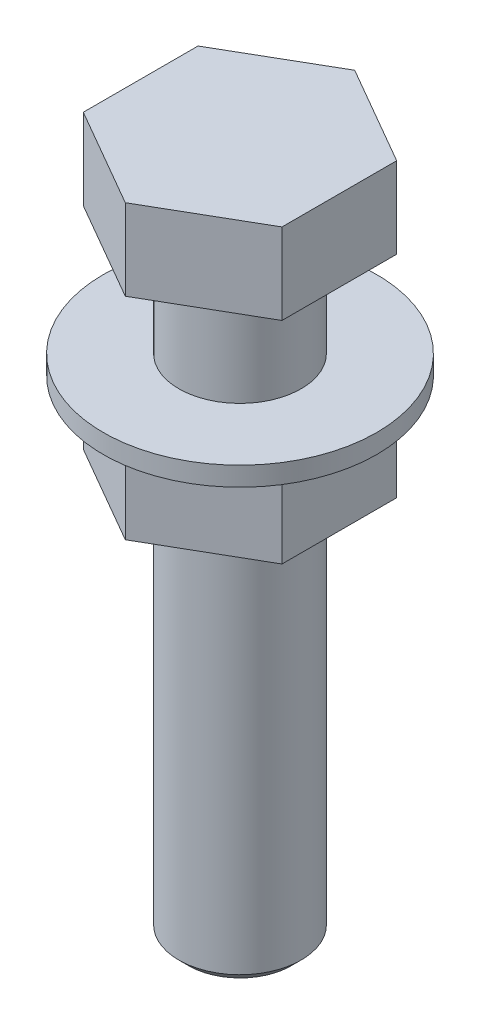
ISO-10303-21;
HEADER;
FILE_DESCRIPTION(('STEP AP214'),'2;1');
FILE_NAME('part.step','',(''),(''),'','','');
FILE_SCHEMA(('AUTOMOTIVE_DESIGN { 1 0 10303 214 1 1 1 1 }'));
ENDSEC;
DATA;
#1=APPLICATION_CONTEXT('core data for automotive mechanical design processes');
#2=APPLICATION_PROTOCOL_DEFINITION('international standard','automotive_design',2000,#1);
#3=PRODUCT_CONTEXT('',#1,'mechanical');
#4=PRODUCT('Part','Part','',(#3));
#5=PRODUCT_RELATED_PRODUCT_CATEGORY('part','',(#4));
#6=PRODUCT_DEFINITION_FORMATION('','',#4);
#7=PRODUCT_DEFINITION_CONTEXT('part definition',#1,'design');
#8=PRODUCT_DEFINITION('design','',#6,#7);
#9=PRODUCT_DEFINITION_SHAPE('','',#8);
#10=(LENGTH_UNIT() NAMED_UNIT(*) SI_UNIT(.MILLI.,.METRE.));
#11=(NAMED_UNIT(*) PLANE_ANGLE_UNIT() SI_UNIT($,.RADIAN.));
#12=(NAMED_UNIT(*) SI_UNIT($,.STERADIAN.) SOLID_ANGLE_UNIT());
#13=UNCERTAINTY_MEASURE_WITH_UNIT(LENGTH_MEASURE(1.E-05),#10,'distance_accuracy_value','');
#14=(GEOMETRIC_REPRESENTATION_CONTEXT(3) GLOBAL_UNCERTAINTY_ASSIGNED_CONTEXT((#13)) GLOBAL_UNIT_ASSIGNED_CONTEXT((#10,
#11,#12)) REPRESENTATION_CONTEXT('',''));
#15=CARTESIAN_POINT('',(0.,0.,0.));
#16=DIRECTION('',(0.,0.,1.));
#17=DIRECTION('',(1.,0.,0.));
#18=AXIS2_PLACEMENT_3D('',#15,#16,#17);
#19=CARTESIAN_POINT('',(-157.780092525626,-127.585139510407,203.199970248206));
#20=DIRECTION('',(1.,0.,0.));
#21=DIRECTION('',(0.,0.,1.));
#22=AXIS2_PLACEMENT_3D('',#19,#20,#21);
#23=PLANE('',#22);
#24=DIRECTION('',(0.,-1.,0.));
#25=VECTOR('',#24,1.);
#26=CARTESIAN_POINT('',(-157.780092525626,-127.585139510407,210.705523747672));
#27=LINE('',#26,#25);
#28=CARTESIAN_POINT('',(-157.780092525626,-153.79696890097,210.705523747672));
#29=VERTEX_POINT('',#28);
#30=CARTESIAN_POINT('',(-157.780092525626,-148.24696890097,210.705523747672));
#31=VERTEX_POINT('',#30);
#32=EDGE_CURVE('P0_E88',#29,#31,#27,.F.);
#33=ORIENTED_EDGE('',*,*,#32,.F.);
#34=DIRECTION('',(0.,0.,1.));
#35=VECTOR('',#34,1.);
#36=CARTESIAN_POINT('',(-157.780092525626,-153.79696890097,210.705523747672));
#37=LINE('',#36,#35);
#38=CARTESIAN_POINT('',(-157.780092525626,-153.79696890097,203.199970248206));
#39=VERTEX_POINT('',#38);
#40=EDGE_CURVE('P0_E74',#39,#29,#37,.T.);
#41=ORIENTED_EDGE('',*,*,#40,.F.);
#42=DIRECTION('',(0.,-1.,0.));
#43=VECTOR('',#42,1.);
#44=CARTESIAN_POINT('',(-157.780092525626,-127.585139510407,203.199970248206));
#45=LINE('',#44,#43);
#46=CARTESIAN_POINT('',(-157.780092525626,-148.24696890097,203.199970248206));
#47=VERTEX_POINT('',#46);
#48=EDGE_CURVE('P0_E68',#47,#39,#45,.T.);
#49=ORIENTED_EDGE('',*,*,#48,.F.);
#50=DIRECTION('',(0.,0.,1.));
#51=VECTOR('',#50,1.);
#52=CARTESIAN_POINT('',(-157.780092525626,-148.24696890097,206.952746997939));
#53=LINE('',#52,#51);
#54=EDGE_CURVE('P0_E89',#31,#47,#53,.F.);
#55=ORIENTED_EDGE('',*,*,#54,.F.);
#56=EDGE_LOOP('',(#33,#41,#49,#55));
#57=FACE_BOUND('',#56,.T.);
#58=ADVANCED_FACE('P0_F17',(#57),#23,.T.);
#59=CARTESIAN_POINT('',(-164.280092525626,-127.585139510407,199.447193498474));
#60=DIRECTION('',(0.5,0.,-0.866025403784439));
#61=DIRECTION('',(0.866025403784439,0.,0.5));
#62=AXIS2_PLACEMENT_3D('',#59,#60,#61);
#63=PLANE('',#62);
#64=ORIENTED_EDGE('',*,*,#48,.T.);
#65=DIRECTION('',(0.866025403784439,0.,0.499999999999999));
#66=VECTOR('',#65,1.);
#67=CARTESIAN_POINT('',(-164.280092525626,-153.79696890097,199.447193498474));
#68=LINE('',#67,#66);
#69=CARTESIAN_POINT('',(-164.280092525626,-153.79696890097,199.447193498474));
#70=VERTEX_POINT('',#69);
#71=EDGE_CURVE('P0_E83',#70,#39,#68,.T.);
#72=ORIENTED_EDGE('',*,*,#71,.F.);
#73=DIRECTION('',(0.,-1.,0.));
#74=VECTOR('',#73,1.);
#75=CARTESIAN_POINT('',(-164.280092525626,-127.585139510407,199.447193498474));
#76=LINE('',#75,#74);
#77=CARTESIAN_POINT('',(-164.280092525626,-148.24696890097,199.447193498474));
#78=VERTEX_POINT('',#77);
#79=EDGE_CURVE('P0_E105',#78,#70,#76,.T.);
#80=ORIENTED_EDGE('',*,*,#79,.F.);
#81=DIRECTION('',(-0.866025403784438,0.,-0.5));
#82=VECTOR('',#81,1.);
#83=CARTESIAN_POINT('',(-157.780092525626,-148.24696890097,203.199970248206));
#84=LINE('',#83,#82);
#85=EDGE_CURVE('P0_E123',#47,#78,#84,.T.);
#86=ORIENTED_EDGE('',*,*,#85,.F.);
#87=EDGE_LOOP('',(#64,#72,#80,#86));
#88=FACE_BOUND('',#87,.T.);
#89=ADVANCED_FACE('P0_F139',(#88),#63,.T.);
#90=CARTESIAN_POINT('',(-170.780092525626,-127.585139510407,203.199970248206));
#91=DIRECTION('',(-0.5,0.,-0.866025403784439));
#92=DIRECTION('',(0.866025403784439,0.,-0.5));
#93=AXIS2_PLACEMENT_3D('',#90,#91,#92);
#94=PLANE('',#93);
#95=ORIENTED_EDGE('',*,*,#79,.T.);
#96=DIRECTION('',(0.866025403784439,0.,-0.499999999999999));
#97=VECTOR('',#96,1.);
#98=CARTESIAN_POINT('',(-170.780092525626,-153.79696890097,203.199970248206));
#99=LINE('',#98,#97);
#100=CARTESIAN_POINT('',(-170.780092525626,-153.79696890097,203.199970248206));
#101=VERTEX_POINT('',#100);
#102=EDGE_CURVE('P0_E127',#101,#70,#99,.T.);
#103=ORIENTED_EDGE('',*,*,#102,.F.);
#104=DIRECTION('',(0.,-1.,0.));
#105=VECTOR('',#104,1.);
#106=CARTESIAN_POINT('',(-170.780092525626,-127.585139510407,203.199970248206));
#107=LINE('',#106,#105);
#108=CARTESIAN_POINT('',(-170.780092525626,-148.24696890097,203.199970248206));
#109=VERTEX_POINT('',#108);
#110=EDGE_CURVE('P0_E103',#109,#101,#107,.T.);
#111=ORIENTED_EDGE('',*,*,#110,.F.);
#112=DIRECTION('',(-0.866025403784439,0.,0.5));
#113=VECTOR('',#112,1.);
#114=CARTESIAN_POINT('',(-164.280092525626,-148.24696890097,199.447193498474));
#115=LINE('',#114,#113);
#116=EDGE_CURVE('P0_E121',#78,#109,#115,.T.);
#117=ORIENTED_EDGE('',*,*,#116,.F.);
#118=EDGE_LOOP('',(#95,#103,#111,#117));
#119=FACE_BOUND('',#118,.T.);
#120=ADVANCED_FACE('P0_F135',(#119),#94,.T.);
#121=CARTESIAN_POINT('',(-170.780092525626,-127.585139510407,210.705523747672));
#122=DIRECTION('',(-1.,0.,0.));
#123=DIRECTION('',(0.,0.,-1.));
#124=AXIS2_PLACEMENT_3D('',#121,#122,#123);
#125=PLANE('',#124);
#126=ORIENTED_EDGE('',*,*,#110,.T.);
#127=DIRECTION('',(0.,0.,1.));
#128=VECTOR('',#127,1.);
#129=CARTESIAN_POINT('',(-170.780092525626,-153.79696890097,210.705523747672));
#130=LINE('',#129,#128);
#131=CARTESIAN_POINT('',(-170.780092525626,-153.79696890097,210.705523747672));
#132=VERTEX_POINT('',#131);
#133=EDGE_CURVE('P0_E97',#132,#101,#130,.F.);
#134=ORIENTED_EDGE('',*,*,#133,.F.);
#135=DIRECTION('',(0.,-1.,0.));
#136=VECTOR('',#135,1.);
#137=CARTESIAN_POINT('',(-170.780092525626,-127.585139510407,210.705523747672));
#138=LINE('',#137,#136);
#139=CARTESIAN_POINT('',(-170.780092525626,-148.24696890097,210.705523747672));
#140=VERTEX_POINT('',#139);
#141=EDGE_CURVE('P0_E92',#140,#132,#138,.T.);
#142=ORIENTED_EDGE('',*,*,#141,.F.);
#143=DIRECTION('',(0.,0.,1.));
#144=VECTOR('',#143,1.);
#145=CARTESIAN_POINT('',(-170.780092525626,-148.24696890097,206.952746997939));
#146=LINE('',#145,#144);
#147=EDGE_CURVE('P0_E117',#109,#140,#146,.T.);
#148=ORIENTED_EDGE('',*,*,#147,.F.);
#149=EDGE_LOOP('',(#126,#134,#142,#148));
#150=FACE_BOUND('',#149,.T.);
#151=ADVANCED_FACE('P0_F141',(#150),#125,.T.);
#152=CARTESIAN_POINT('',(-164.280092525626,-127.585139510407,214.458300497404));
#153=DIRECTION('',(-0.5,0.,0.866025403784439));
#154=DIRECTION('',(-0.866025403784439,0.,-0.5));
#155=AXIS2_PLACEMENT_3D('',#152,#153,#154);
#156=PLANE('',#155);
#157=ORIENTED_EDGE('',*,*,#141,.T.);
#158=DIRECTION('',(-0.866025403784439,0.,-0.499999999999999));
#159=VECTOR('',#158,1.);
#160=CARTESIAN_POINT('',(-164.280092525626,-153.79696890097,214.458300497404));
#161=LINE('',#160,#159);
#162=CARTESIAN_POINT('',(-164.280092525626,-153.79696890097,214.458300497404));
#163=VERTEX_POINT('',#162);
#164=EDGE_CURVE('P0_E95',#163,#132,#161,.T.);
#165=ORIENTED_EDGE('',*,*,#164,.F.);
#166=DIRECTION('',(0.,-1.,0.));
#167=VECTOR('',#166,1.);
#168=CARTESIAN_POINT('',(-164.280092525626,-127.585139510407,214.458300497404));
#169=LINE('',#168,#167);
#170=CARTESIAN_POINT('',(-164.280092525626,-148.24696890097,214.458300497404));
#171=VERTEX_POINT('',#170);
#172=EDGE_CURVE('P0_E85',#171,#163,#169,.T.);
#173=ORIENTED_EDGE('',*,*,#172,.F.);
#174=DIRECTION('',(0.866025403784439,0.,0.499999999999999));
#175=VECTOR('',#174,1.);
#176=CARTESIAN_POINT('',(-170.780092525626,-148.24696890097,210.705523747672));
#177=LINE('',#176,#175);
#178=EDGE_CURVE('P0_E35',#140,#171,#177,.T.);
#179=ORIENTED_EDGE('',*,*,#178,.F.);
#180=EDGE_LOOP('',(#157,#165,#173,#179));
#181=FACE_BOUND('',#180,.T.);
#182=ADVANCED_FACE('P0_F143',(#181),#156,.T.);
#183=CARTESIAN_POINT('',(-157.780092525626,-127.585139510407,210.705523747672));
#184=DIRECTION('',(0.5,0.,0.866025403784439));
#185=DIRECTION('',(-0.866025403784439,0.,0.5));
#186=AXIS2_PLACEMENT_3D('',#183,#184,#185);
#187=PLANE('',#186);
#188=ORIENTED_EDGE('',*,*,#172,.T.);
#189=DIRECTION('',(-0.866025403784439,0.,0.499999999999999));
#190=VECTOR('',#189,1.);
#191=CARTESIAN_POINT('',(-157.780092525626,-153.79696890097,210.705523747672));
#192=LINE('',#191,#190);
#193=EDGE_CURVE('P0_E81',#29,#163,#192,.T.);
#194=ORIENTED_EDGE('',*,*,#193,.F.);
#195=ORIENTED_EDGE('',*,*,#32,.T.);
#196=DIRECTION('',(0.866025403784439,0.,-0.499999999999999));
#197=VECTOR('',#196,1.);
#198=CARTESIAN_POINT('',(-164.280092525626,-148.24696890097,214.458300497404));
#199=LINE('',#198,#197);
#200=EDGE_CURVE('P0_E114',#171,#31,#199,.T.);
#201=ORIENTED_EDGE('',*,*,#200,.F.);
#202=EDGE_LOOP('',(#188,#194,#195,#201));
#203=FACE_BOUND('',#202,.T.);
#204=ADVANCED_FACE('P0_F94',(#203),#187,.T.);
#205=CARTESIAN_POINT('',(-157.780092525626,-153.79696890097,210.705523747672));
#206=DIRECTION('',(0.,-1.,0.));
#207=DIRECTION('',(1.,0.,0.));
#208=AXIS2_PLACEMENT_3D('',#205,#206,#207);
#209=PLANE('',#208);
#210=ORIENTED_EDGE('',*,*,#102,.T.);
#211=ORIENTED_EDGE('',*,*,#71,.T.);
#212=ORIENTED_EDGE('',*,*,#40,.T.);
#213=ORIENTED_EDGE('',*,*,#193,.T.);
#214=ORIENTED_EDGE('',*,*,#164,.T.);
#215=ORIENTED_EDGE('',*,*,#133,.T.);
#216=EDGE_LOOP('',(#210,#211,#212,#213,#214,#215));
#217=FACE_BOUND('',#216,.T.);
#218=CARTESIAN_POINT('',(-164.280092525626,-153.79696890097,206.952746997939));
#219=DIRECTION('',(0.,1.,0.));
#220=DIRECTION('',(-1.,0.,0.));
#221=AXIS2_PLACEMENT_3D('',#218,#219,#220);
#222=CIRCLE('',#221,3.375);
#223=CARTESIAN_POINT('',(-167.655092525626,-153.79696890097,206.952746997939));
#224=VERTEX_POINT('',#223);
#225=EDGE_CURVE('P0_E20',#224,#224,#222,.T.);
#226=ORIENTED_EDGE('',*,*,#225,.T.);
#227=EDGE_LOOP('',(#226));
#228=FACE_BOUND('',#227,.T.);
#229=ADVANCED_FACE('P0_F77',(#217,#228),#209,.T.);
#230=CARTESIAN_POINT('',(-164.280092525626,-148.24696890097,206.952746997939));
#231=DIRECTION('',(0.,-1.,0.));
#232=DIRECTION('',(1.,0.,0.));
#233=AXIS2_PLACEMENT_3D('',#230,#231,#232);
#234=PLANE('',#233);
#235=CARTESIAN_POINT('',(-164.280092525626,-148.24696890097,206.952746997939));
#236=DIRECTION('',(0.,-1.,0.));
#237=DIRECTION('',(1.,0.,0.));
#238=AXIS2_PLACEMENT_3D('',#235,#236,#237);
#239=CIRCLE('',#238,8.95);
#240=CARTESIAN_POINT('',(-155.330092525626,-148.24696890097,206.952746997939));
#241=VERTEX_POINT('',#240);
#242=EDGE_CURVE('P0_E109',#241,#241,#239,.F.);
#243=ORIENTED_EDGE('',*,*,#242,.F.);
#244=EDGE_LOOP('',(#243));
#245=FACE_BOUND('',#244,.T.);
#246=ORIENTED_EDGE('',*,*,#178,.T.);
#247=ORIENTED_EDGE('',*,*,#200,.T.);
#248=ORIENTED_EDGE('',*,*,#54,.T.);
#249=ORIENTED_EDGE('',*,*,#85,.T.);
#250=ORIENTED_EDGE('',*,*,#116,.T.);
#251=ORIENTED_EDGE('',*,*,#147,.T.);
#252=EDGE_LOOP('',(#246,#247,#248,#249,#250,#251));
#253=FACE_BOUND('',#252,.T.);
#254=ADVANCED_FACE('P0_F140',(#245,#253),#234,.T.);
#255=CARTESIAN_POINT('',(-164.280092525626,-146.996968900858,206.952746997939));
#256=DIRECTION('',(0.,1.,0.));
#257=DIRECTION('',(-1.,0.,0.));
#258=AXIS2_PLACEMENT_3D('',#255,#256,#257);
#259=CYLINDRICAL_SURFACE('',#258,3.375);
#260=CARTESIAN_POINT('',(-164.280092525626,-146.996968900858,206.952746997939));
#261=DIRECTION('',(0.,1.,0.));
#262=DIRECTION('',(-1.,0.,0.));
#263=AXIS2_PLACEMENT_3D('',#260,#261,#262);
#264=CIRCLE('',#263,3.375);
#265=CARTESIAN_POINT('',(-167.655092525626,-146.996968900858,206.952746997939));
#266=VERTEX_POINT('',#265);
#267=EDGE_CURVE('P0_E26',#266,#266,#264,.T.);
#268=ORIENTED_EDGE('',*,*,#267,.T.);
#269=EDGE_LOOP('',(#268));
#270=FACE_BOUND('',#269,.T.);
#271=ORIENTED_EDGE('',*,*,#225,.F.);
#272=EDGE_LOOP('',(#271));
#273=FACE_BOUND('',#272,.T.);
#274=ADVANCED_FACE('P0_F163',(#270,#273),#259,.F.);
#275=CARTESIAN_POINT('',(-164.280092525626,-148.24696890097,206.952746997939));
#276=DIRECTION('',(0.,-1.,0.));
#277=DIRECTION('',(1.,0.,0.));
#278=AXIS2_PLACEMENT_3D('',#275,#276,#277);
#279=CYLINDRICAL_SURFACE('',#278,8.95);
#280=CARTESIAN_POINT('',(-164.280092525626,-146.99696890097,206.952746997939));
#281=DIRECTION('',(0.,-1.,0.));
#282=DIRECTION('',(1.,0.,0.));
#283=AXIS2_PLACEMENT_3D('',#280,#281,#282);
#284=CIRCLE('',#283,8.95);
#285=CARTESIAN_POINT('',(-155.330092525626,-146.99696890097,206.952746997939));
#286=VERTEX_POINT('',#285);
#287=EDGE_CURVE('P0_E11',#286,#286,#284,.T.);
#288=ORIENTED_EDGE('',*,*,#287,.T.);
#289=EDGE_LOOP('',(#288));
#290=FACE_BOUND('',#289,.T.);
#291=ORIENTED_EDGE('',*,*,#242,.T.);
#292=EDGE_LOOP('',(#291));
#293=FACE_BOUND('',#292,.T.);
#294=ADVANCED_FACE('P0_F156',(#290,#293),#279,.T.);
#295=CARTESIAN_POINT('',(-164.280092525626,-146.99696890097,206.952746997939));
#296=DIRECTION('',(0.,-1.,0.));
#297=DIRECTION('',(1.,0.,0.));
#298=AXIS2_PLACEMENT_3D('',#295,#296,#297);
#299=PLANE('',#298);
#300=ORIENTED_EDGE('',*,*,#287,.F.);
#301=EDGE_LOOP('',(#300));
#302=FACE_BOUND('',#301,.T.);
#303=ORIENTED_EDGE('',*,*,#267,.F.);
#304=EDGE_LOOP('',(#303));
#305=FACE_BOUND('',#304,.T.);
#306=ADVANCED_FACE('P0_F154',(#302,#305),#299,.F.);
#307=CLOSED_SHELL('',(#58,#89,#120,#151,#182,#204,#229,#254,#274,#294,#306));
#308=MANIFOLD_SOLID_BREP('P0_B1',#307);
#309=CARTESIAN_POINT('',(-170.780092525626,-134.69696890097,210.705523747643));
#310=DIRECTION('',(0.,1.,0.));
#311=DIRECTION('',(-1.,0.,0.));
#312=AXIS2_PLACEMENT_3D('',#309,#310,#311);
#313=PLANE('',#312);
#314=DIRECTION('',(0.866025403784439,0.,0.5));
#315=VECTOR('',#314,1.);
#316=CARTESIAN_POINT('',(-157.780092525626,-134.69696890097,203.199970248177));
#317=LINE('',#316,#315);
#318=CARTESIAN_POINT('',(-157.780092525626,-134.69696890097,203.199970248177));
#319=VERTEX_POINT('',#318);
#320=CARTESIAN_POINT('',(-164.280092525626,-134.69696890097,199.447193498445));
#321=VERTEX_POINT('',#320);
#322=EDGE_CURVE('P1_E126',#319,#321,#317,.F.);
#323=ORIENTED_EDGE('',*,*,#322,.T.);
#324=DIRECTION('',(0.866025403784439,0.,-0.5));
#325=VECTOR('',#324,1.);
#326=CARTESIAN_POINT('',(-164.280092525626,-134.69696890097,199.447193498445));
#327=LINE('',#326,#325);
#328=CARTESIAN_POINT('',(-170.780092525626,-134.69696890097,203.199970248177));
#329=VERTEX_POINT('',#328);
#330=EDGE_CURVE('P1_E121',#321,#329,#327,.F.);
#331=ORIENTED_EDGE('',*,*,#330,.T.);
#332=DIRECTION('',(0.,0.,-1.));
#333=VECTOR('',#332,1.);
#334=CARTESIAN_POINT('',(-170.780092525626,-134.69696890097,203.199970248177));
#335=LINE('',#334,#333);
#336=CARTESIAN_POINT('',(-170.780092525626,-134.69696890097,210.705523747643));
#337=VERTEX_POINT('',#336);
#338=EDGE_CURVE('P1_E74',#329,#337,#335,.F.);
#339=ORIENTED_EDGE('',*,*,#338,.T.);
#340=DIRECTION('',(-0.866025403784439,0.,-0.5));
#341=VECTOR('',#340,1.);
#342=CARTESIAN_POINT('',(-170.780092525626,-134.69696890097,210.705523747643));
#343=LINE('',#342,#341);
#344=CARTESIAN_POINT('',(-164.280092525626,-134.69696890097,214.458300497375));
#345=VERTEX_POINT('',#344);
#346=EDGE_CURVE('P1_E71',#337,#345,#343,.F.);
#347=ORIENTED_EDGE('',*,*,#346,.T.);
#348=DIRECTION('',(-0.866025403784439,0.,0.5));
#349=VECTOR('',#348,1.);
#350=CARTESIAN_POINT('',(-164.280092525626,-134.69696890097,214.458300497375));
#351=LINE('',#350,#349);
#352=CARTESIAN_POINT('',(-157.780092525626,-134.69696890097,210.705523747643));
#353=VERTEX_POINT('',#352);
#354=EDGE_CURVE('P1_E68',#345,#353,#351,.F.);
#355=ORIENTED_EDGE('',*,*,#354,.T.);
#356=DIRECTION('',(0.,0.,1.));
#357=VECTOR('',#356,1.);
#358=CARTESIAN_POINT('',(-157.780092525626,-134.69696890097,210.705523747643));
#359=LINE('',#358,#357);
#360=EDGE_CURVE('P1_E91',#353,#319,#359,.F.);
#361=ORIENTED_EDGE('',*,*,#360,.T.);
#362=EDGE_LOOP('',(#323,#331,#339,#347,#355,#361));
#363=FACE_BOUND('',#362,.T.);
#364=ADVANCED_FACE('P1_F17',(#363),#313,.T.);
#365=CARTESIAN_POINT('',(-170.780092525626,-134.69696890097,210.705523747643));
#366=DIRECTION('',(0.5,0.,-0.866025403784439));
#367=DIRECTION('',(-0.866025403784439,0.,-0.5));
#368=AXIS2_PLACEMENT_3D('',#365,#366,#367);
#369=PLANE('',#368);
#370=DIRECTION('',(0.,1.,0.));
#371=VECTOR('',#370,1.);
#372=CARTESIAN_POINT('',(-164.280092525626,-134.69696890097,214.458300497375));
#373=LINE('',#372,#371);
#374=CARTESIAN_POINT('',(-164.280092525626,-139.99696890097,214.458300497375));
#375=VERTEX_POINT('',#374);
#376=EDGE_CURVE('P1_E77',#375,#345,#373,.T.);
#377=ORIENTED_EDGE('',*,*,#376,.T.);
#378=ORIENTED_EDGE('',*,*,#346,.F.);
#379=DIRECTION('',(0.,1.,0.));
#380=VECTOR('',#379,1.);
#381=CARTESIAN_POINT('',(-170.780092525626,-134.69696890097,210.705523747643));
#382=LINE('',#381,#380);
#383=CARTESIAN_POINT('',(-170.780092525626,-139.99696890097,210.705523747643));
#384=VERTEX_POINT('',#383);
#385=EDGE_CURVE('P1_E116',#337,#384,#382,.F.);
#386=ORIENTED_EDGE('',*,*,#385,.T.);
#387=DIRECTION('',(0.866025403784438,0.,0.5));
#388=VECTOR('',#387,1.);
#389=CARTESIAN_POINT('',(-170.780092525626,-139.99696890097,210.705523747643));
#390=LINE('',#389,#388);
#391=EDGE_CURVE('P1_E82',#384,#375,#390,.T.);
#392=ORIENTED_EDGE('',*,*,#391,.T.);
#393=EDGE_LOOP('',(#377,#378,#386,#392));
#394=FACE_BOUND('',#393,.T.);
#395=ADVANCED_FACE('P1_F80',(#394),#369,.F.);
#396=CARTESIAN_POINT('',(-164.280092525626,-134.69696890097,214.458300497375));
#397=DIRECTION('',(-0.5,0.,-0.866025403784439));
#398=DIRECTION('',(-0.866025403784439,0.,0.5));
#399=AXIS2_PLACEMENT_3D('',#396,#397,#398);
#400=PLANE('',#399);
#401=DIRECTION('',(0.,1.,0.));
#402=VECTOR('',#401,1.);
#403=CARTESIAN_POINT('',(-157.780092525626,-134.69696890097,210.705523747643));
#404=LINE('',#403,#402);
#405=CARTESIAN_POINT('',(-157.780092525626,-139.99696890097,210.705523747643));
#406=VERTEX_POINT('',#405);
#407=EDGE_CURVE('P1_E88',#406,#353,#404,.T.);
#408=ORIENTED_EDGE('',*,*,#407,.T.);
#409=ORIENTED_EDGE('',*,*,#354,.F.);
#410=ORIENTED_EDGE('',*,*,#376,.F.);
#411=DIRECTION('',(0.866025403784439,0.,-0.5));
#412=VECTOR('',#411,1.);
#413=CARTESIAN_POINT('',(-164.280092525626,-139.99696890097,214.458300497375));
#414=LINE('',#413,#412);
#415=EDGE_CURVE('P1_E113',#375,#406,#414,.T.);
#416=ORIENTED_EDGE('',*,*,#415,.T.);
#417=EDGE_LOOP('',(#408,#409,#410,#416));
#418=FACE_BOUND('',#417,.T.);
#419=ADVANCED_FACE('P1_F86',(#418),#400,.F.);
#420=CARTESIAN_POINT('',(-157.780092525626,-134.69696890097,210.705523747643));
#421=DIRECTION('',(-1.,0.,0.));
#422=DIRECTION('',(0.,0.,1.));
#423=AXIS2_PLACEMENT_3D('',#420,#421,#422);
#424=PLANE('',#423);
#425=DIRECTION('',(0.,1.,0.));
#426=VECTOR('',#425,1.);
#427=CARTESIAN_POINT('',(-157.780092525626,-134.69696890097,203.199970248177));
#428=LINE('',#427,#426);
#429=CARTESIAN_POINT('',(-157.780092525626,-139.99696890097,203.199970248177));
#430=VERTEX_POINT('',#429);
#431=EDGE_CURVE('P1_E128',#430,#319,#428,.T.);
#432=ORIENTED_EDGE('',*,*,#431,.T.);
#433=ORIENTED_EDGE('',*,*,#360,.F.);
#434=ORIENTED_EDGE('',*,*,#407,.F.);
#435=DIRECTION('',(0.,0.,1.));
#436=VECTOR('',#435,1.);
#437=CARTESIAN_POINT('',(-157.780092525626,-139.99696890097,210.705523747643));
#438=LINE('',#437,#436);
#439=EDGE_CURVE('P1_E111',#406,#430,#438,.F.);
#440=ORIENTED_EDGE('',*,*,#439,.T.);
#441=EDGE_LOOP('',(#432,#433,#434,#440));
#442=FACE_BOUND('',#441,.T.);
#443=ADVANCED_FACE('P1_F133',(#442),#424,.F.);
#444=CARTESIAN_POINT('',(-157.780092525626,-134.69696890097,203.199970248177));
#445=DIRECTION('',(-0.5,0.,0.866025403784439));
#446=DIRECTION('',(0.866025403784439,0.,0.5));
#447=AXIS2_PLACEMENT_3D('',#444,#445,#446);
#448=PLANE('',#447);
#449=DIRECTION('',(0.,1.,0.));
#450=VECTOR('',#449,1.);
#451=CARTESIAN_POINT('',(-164.280092525626,-134.69696890097,199.447193498445));
#452=LINE('',#451,#450);
#453=CARTESIAN_POINT('',(-164.280092525626,-139.99696890097,199.447193498445));
#454=VERTEX_POINT('',#453);
#455=EDGE_CURVE('P1_E123',#454,#321,#452,.T.);
#456=ORIENTED_EDGE('',*,*,#455,.T.);
#457=ORIENTED_EDGE('',*,*,#322,.F.);
#458=ORIENTED_EDGE('',*,*,#431,.F.);
#459=DIRECTION('',(-0.866025403784439,0.,-0.499999999999999));
#460=VECTOR('',#459,1.);
#461=CARTESIAN_POINT('',(-157.780092525626,-139.99696890097,203.199970248177));
#462=LINE('',#461,#460);
#463=EDGE_CURVE('P1_E105',#430,#454,#462,.T.);
#464=ORIENTED_EDGE('',*,*,#463,.T.);
#465=EDGE_LOOP('',(#456,#457,#458,#464));
#466=FACE_BOUND('',#465,.T.);
#467=ADVANCED_FACE('P1_F137',(#466),#448,.F.);
#468=CARTESIAN_POINT('',(-164.280092525626,-134.69696890097,199.447193498445));
#469=DIRECTION('',(0.5,0.,0.866025403784439));
#470=DIRECTION('',(0.866025403784439,0.,-0.5));
#471=AXIS2_PLACEMENT_3D('',#468,#469,#470);
#472=PLANE('',#471);
#473=DIRECTION('',(0.,1.,0.));
#474=VECTOR('',#473,1.);
#475=CARTESIAN_POINT('',(-170.780092525626,-134.69696890097,203.199970248177));
#476=LINE('',#475,#474);
#477=CARTESIAN_POINT('',(-170.780092525626,-139.99696890097,203.199970248177));
#478=VERTEX_POINT('',#477);
#479=EDGE_CURVE('P1_E119',#478,#329,#476,.T.);
#480=ORIENTED_EDGE('',*,*,#479,.T.);
#481=ORIENTED_EDGE('',*,*,#330,.F.);
#482=ORIENTED_EDGE('',*,*,#455,.F.);
#483=DIRECTION('',(-0.866025403784439,0.,0.499999999999999));
#484=VECTOR('',#483,1.);
#485=CARTESIAN_POINT('',(-164.280092525626,-139.99696890097,199.447193498445));
#486=LINE('',#485,#484);
#487=EDGE_CURVE('P1_E35',#454,#478,#486,.T.);
#488=ORIENTED_EDGE('',*,*,#487,.T.);
#489=EDGE_LOOP('',(#480,#481,#482,#488));
#490=FACE_BOUND('',#489,.T.);
#491=ADVANCED_FACE('P1_F139',(#490),#472,.F.);
#492=CARTESIAN_POINT('',(-170.780092525626,-134.69696890097,203.199970248177));
#493=DIRECTION('',(1.,0.,0.));
#494=DIRECTION('',(0.,0.,-1.));
#495=AXIS2_PLACEMENT_3D('',#492,#493,#494);
#496=PLANE('',#495);
#497=ORIENTED_EDGE('',*,*,#385,.F.);
#498=ORIENTED_EDGE('',*,*,#338,.F.);
#499=ORIENTED_EDGE('',*,*,#479,.F.);
#500=DIRECTION('',(0.,0.,1.));
#501=VECTOR('',#500,1.);
#502=CARTESIAN_POINT('',(-170.780092525626,-139.99696890097,210.705523747643));
#503=LINE('',#502,#501);
#504=EDGE_CURVE('P1_E98',#478,#384,#503,.T.);
#505=ORIENTED_EDGE('',*,*,#504,.T.);
#506=EDGE_LOOP('',(#497,#498,#499,#505));
#507=FACE_BOUND('',#506,.T.);
#508=ADVANCED_FACE('P1_F140',(#507),#496,.F.);
#509=CARTESIAN_POINT('',(-164.280092525626,-179.99696890097,206.95274699791));
#510=DIRECTION('',(0.,1.,0.));
#511=DIRECTION('',(-1.,0.,0.));
#512=AXIS2_PLACEMENT_3D('',#509,#510,#511);
#513=PLANE('',#512);
#514=CARTESIAN_POINT('',(-164.280092525626,-179.996968900934,206.95274699791));
#515=DIRECTION('',(0.,1.,0.));
#516=DIRECTION('',(-1.,0.,0.));
#517=AXIS2_PLACEMENT_3D('',#514,#515,#516);
#518=CIRCLE('',#517,3.37500000000546);
#519=CARTESIAN_POINT('',(-167.655092525632,-179.996968900934,206.95274699791));
#520=VERTEX_POINT('',#519);
#521=EDGE_CURVE('P1_E20',#520,#520,#518,.T.);
#522=ORIENTED_EDGE('',*,*,#521,.F.);
#523=EDGE_LOOP('',(#522));
#524=FACE_BOUND('',#523,.T.);
#525=ADVANCED_FACE('P1_F142',(#524),#513,.F.);
#526=CARTESIAN_POINT('',(-170.780092525626,-139.99696890097,210.705523747643));
#527=DIRECTION('',(0.,1.,0.));
#528=DIRECTION('',(-1.,0.,0.));
#529=AXIS2_PLACEMENT_3D('',#526,#527,#528);
#530=PLANE('',#529);
#531=CARTESIAN_POINT('',(-164.280092525626,-139.99696890097,206.95274699791));
#532=DIRECTION('',(0.,1.,0.));
#533=DIRECTION('',(-1.,0.,0.));
#534=AXIS2_PLACEMENT_3D('',#531,#532,#533);
#535=CIRCLE('',#534,4.);
#536=CARTESIAN_POINT('',(-168.280092525626,-139.99696890097,206.95274699791));
#537=VERTEX_POINT('',#536);
#538=EDGE_CURVE('P1_E26',#537,#537,#535,.F.);
#539=ORIENTED_EDGE('',*,*,#538,.F.);
#540=EDGE_LOOP('',(#539));
#541=FACE_BOUND('',#540,.T.);
#542=ORIENTED_EDGE('',*,*,#487,.F.);
#543=ORIENTED_EDGE('',*,*,#463,.F.);
#544=ORIENTED_EDGE('',*,*,#439,.F.);
#545=ORIENTED_EDGE('',*,*,#415,.F.);
#546=ORIENTED_EDGE('',*,*,#391,.F.);
#547=ORIENTED_EDGE('',*,*,#504,.F.);
#548=EDGE_LOOP('',(#542,#543,#544,#545,#546,#547));
#549=FACE_BOUND('',#548,.T.);
#550=ADVANCED_FACE('P1_F150',(#541,#549),#530,.F.);
#551=CARTESIAN_POINT('',(-164.280092525626,-179.37196890092,206.95274699791));
#552=DIRECTION('',(0.,1.,0.));
#553=DIRECTION('',(-1.,0.,0.));
#554=AXIS2_PLACEMENT_3D('',#551,#552,#553);
#555=CONICAL_SURFACE('',#554,4.0000000000191,0.785398163397448);
#556=CARTESIAN_POINT('',(-164.280092525626,-179.37196890097,206.95274699791));
#557=DIRECTION('',(0.,1.,0.));
#558=DIRECTION('',(-1.,0.,0.));
#559=AXIS2_PLACEMENT_3D('',#556,#557,#558);
#560=CIRCLE('',#559,4.);
#561=CARTESIAN_POINT('',(-168.280092525626,-179.37196890097,206.95274699791));
#562=VERTEX_POINT('',#561);
#563=EDGE_CURVE('P1_E11',#562,#562,#560,.T.);
#564=ORIENTED_EDGE('',*,*,#563,.F.);
#565=EDGE_LOOP('',(#564));
#566=FACE_BOUND('',#565,.T.);
#567=ORIENTED_EDGE('',*,*,#521,.T.);
#568=EDGE_LOOP('',(#567));
#569=FACE_BOUND('',#568,.T.);
#570=ADVANCED_FACE('P1_F156',(#566,#569),#555,.T.);
#571=CARTESIAN_POINT('',(-164.280092525626,-130.535637203033,206.95274699791));
#572=DIRECTION('',(0.,1.,0.));
#573=DIRECTION('',(-1.,0.,0.));
#574=AXIS2_PLACEMENT_3D('',#571,#572,#573);
#575=CYLINDRICAL_SURFACE('',#574,4.);
#576=ORIENTED_EDGE('',*,*,#563,.T.);
#577=EDGE_LOOP('',(#576));
#578=FACE_BOUND('',#577,.T.);
#579=ORIENTED_EDGE('',*,*,#538,.T.);
#580=EDGE_LOOP('',(#579));
#581=FACE_BOUND('',#580,.T.);
#582=ADVANCED_FACE('P1_F154',(#578,#581),#575,.T.);
#583=CLOSED_SHELL('',(#364,#395,#419,#443,#467,#491,#508,#525,#550,#570,#582));
#584=MANIFOLD_SOLID_BREP('P1_B1',#583);
#585=ADVANCED_BREP_SHAPE_REPRESENTATION('',(#18,#308,#584),#14);
#586=SHAPE_DEFINITION_REPRESENTATION(#9,#585);
ENDSEC;
END-ISO-10303-21;
